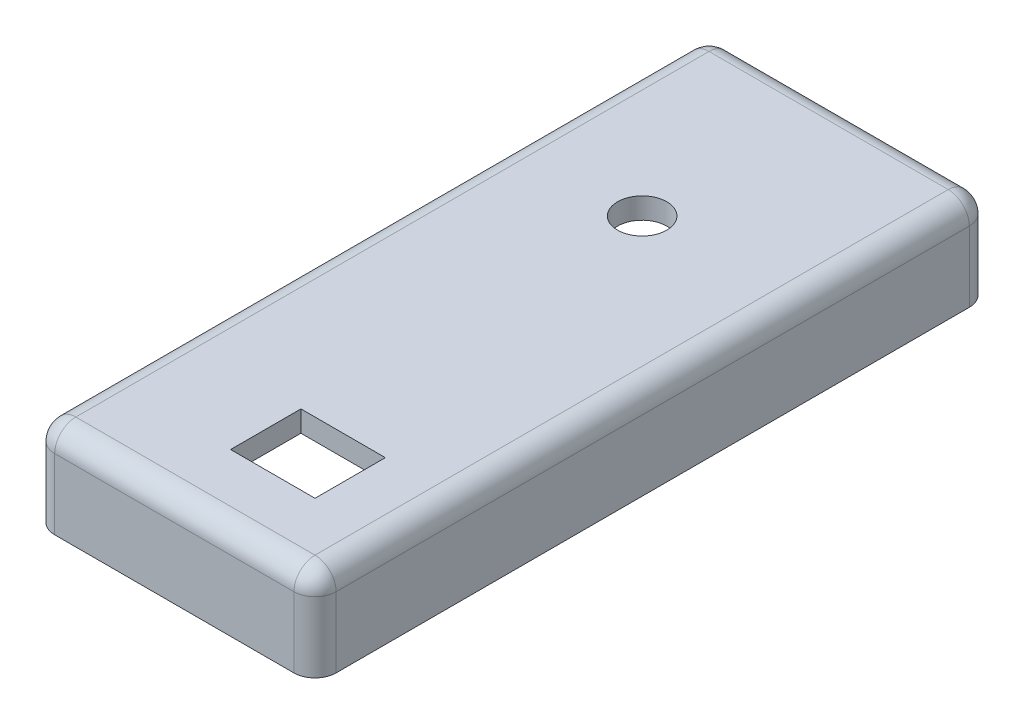
ISO-10303-21;
HEADER;
FILE_DESCRIPTION(('STEP AP214'),'2;1');
FILE_NAME('part.step','',(''),(''),'','','');
FILE_SCHEMA(('AUTOMOTIVE_DESIGN { 1 0 10303 214 1 1 1 1 }'));
ENDSEC;
DATA;
#1=APPLICATION_CONTEXT('core data for automotive mechanical design processes');
#2=APPLICATION_PROTOCOL_DEFINITION('international standard','automotive_design',2000,#1);
#3=PRODUCT_CONTEXT('',#1,'mechanical');
#4=PRODUCT('Part','Part','',(#3));
#5=PRODUCT_RELATED_PRODUCT_CATEGORY('part','',(#4));
#6=PRODUCT_DEFINITION_FORMATION('','',#4);
#7=PRODUCT_DEFINITION_CONTEXT('part definition',#1,'design');
#8=PRODUCT_DEFINITION('design','',#6,#7);
#9=PRODUCT_DEFINITION_SHAPE('','',#8);
#10=(LENGTH_UNIT() NAMED_UNIT(*) SI_UNIT(.MILLI.,.METRE.));
#11=(NAMED_UNIT(*) PLANE_ANGLE_UNIT() SI_UNIT($,.RADIAN.));
#12=(NAMED_UNIT(*) SI_UNIT($,.STERADIAN.) SOLID_ANGLE_UNIT());
#13=UNCERTAINTY_MEASURE_WITH_UNIT(LENGTH_MEASURE(1.E-05),#10,'distance_accuracy_value','');
#14=(GEOMETRIC_REPRESENTATION_CONTEXT(3) GLOBAL_UNCERTAINTY_ASSIGNED_CONTEXT((#13)) GLOBAL_UNIT_ASSIGNED_CONTEXT((#10,
#11,#12)) REPRESENTATION_CONTEXT('',''));
#15=CARTESIAN_POINT('',(0.,0.,0.));
#16=DIRECTION('',(0.,0.,1.));
#17=DIRECTION('',(1.,0.,0.));
#18=AXIS2_PLACEMENT_3D('',#15,#16,#17);
#19=CARTESIAN_POINT('',(0.,0.,0.));
#20=DIRECTION('',(0.,1.,0.));
#21=DIRECTION('',(0.,0.,1.));
#22=AXIS2_PLACEMENT_3D('',#19,#20,#21);
#23=PLANE('',#22);
#24=DIRECTION('',(0.,0.,1.));
#25=VECTOR('',#24,1.);
#26=CARTESIAN_POINT('',(-21.5576292376695,0.,-48.0700530900822));
#27=LINE('',#26,#25);
#28=CARTESIAN_POINT('',(-21.5576292376695,0.,-45.0700530900821));
#29=VERTEX_POINT('',#28);
#30=CARTESIAN_POINT('',(-21.5576292376695,0.,44.9299469099178));
#31=VERTEX_POINT('',#30);
#32=EDGE_CURVE('E237',#29,#31,#27,.T.);
#33=ORIENTED_EDGE('',*,*,#32,.F.);
#34=CARTESIAN_POINT('',(-18.5576292376695,0.,-45.0700530900821));
#35=DIRECTION('',(0.,1.,0.));
#36=DIRECTION('',(0.,0.,1.));
#37=AXIS2_PLACEMENT_3D('',#34,#35,#36);
#38=CIRCLE('',#37,3.);
#39=CARTESIAN_POINT('',(-18.5576292376695,0.,-48.0700530900822));
#40=VERTEX_POINT('',#39);
#41=EDGE_CURVE('E262',#29,#40,#38,.F.);
#42=ORIENTED_EDGE('',*,*,#41,.T.);
#43=DIRECTION('',(-1.,0.,0.));
#44=VECTOR('',#43,1.);
#45=CARTESIAN_POINT('',(-21.5576292376695,0.,-48.0700530900822));
#46=LINE('',#45,#44);
#47=CARTESIAN_POINT('',(15.4423707623305,0.,-48.0700530900822));
#48=VERTEX_POINT('',#47);
#49=EDGE_CURVE('E246',#48,#40,#46,.T.);
#50=ORIENTED_EDGE('',*,*,#49,.F.);
#51=CARTESIAN_POINT('',(15.4423707623305,0.,-45.0700530900821));
#52=DIRECTION('',(0.,1.,0.));
#53=DIRECTION('',(0.,0.,1.));
#54=AXIS2_PLACEMENT_3D('',#51,#52,#53);
#55=CIRCLE('',#54,3.);
#56=CARTESIAN_POINT('',(18.4423707623305,0.,-45.0700530900821));
#57=VERTEX_POINT('',#56);
#58=EDGE_CURVE('E260',#48,#57,#55,.F.);
#59=ORIENTED_EDGE('',*,*,#58,.T.);
#60=DIRECTION('',(0.,0.,-1.));
#61=VECTOR('',#60,1.);
#62=CARTESIAN_POINT('',(18.4423707623305,0.,-48.0700530900822));
#63=LINE('',#62,#61);
#64=CARTESIAN_POINT('',(18.4423707623305,0.,44.9299469099178));
#65=VERTEX_POINT('',#64);
#66=EDGE_CURVE('E243',#65,#57,#63,.T.);
#67=ORIENTED_EDGE('',*,*,#66,.F.);
#68=CARTESIAN_POINT('',(15.4423707623305,0.,44.9299469099179));
#69=DIRECTION('',(0.,1.,0.));
#70=DIRECTION('',(0.,0.,1.));
#71=AXIS2_PLACEMENT_3D('',#68,#69,#70);
#72=CIRCLE('',#71,3.);
#73=CARTESIAN_POINT('',(15.4423707623305,0.,47.9299469099179));
#74=VERTEX_POINT('',#73);
#75=EDGE_CURVE('E258',#65,#74,#72,.F.);
#76=ORIENTED_EDGE('',*,*,#75,.T.);
#77=DIRECTION('',(1.,0.,0.));
#78=VECTOR('',#77,1.);
#79=CARTESIAN_POINT('',(-21.5576292376695,0.,47.9299469099179));
#80=LINE('',#79,#78);
#81=CARTESIAN_POINT('',(-18.5576292376695,0.,47.9299469099179));
#82=VERTEX_POINT('',#81);
#83=EDGE_CURVE('E240',#82,#74,#80,.T.);
#84=ORIENTED_EDGE('',*,*,#83,.F.);
#85=CARTESIAN_POINT('',(-18.5576292376695,0.,44.9299469099179));
#86=DIRECTION('',(0.,1.,0.));
#87=DIRECTION('',(0.,0.,1.));
#88=AXIS2_PLACEMENT_3D('',#85,#86,#87);
#89=CIRCLE('',#88,3.);
#90=EDGE_CURVE('E256',#82,#31,#89,.F.);
#91=ORIENTED_EDGE('',*,*,#90,.T.);
#92=EDGE_LOOP('',(#33,#42,#50,#59,#67,#76,#84,#91));
#93=FACE_BOUND('',#92,.T.);
#94=DIRECTION('',(0.,0.,1.));
#95=VECTOR('',#94,1.);
#96=CARTESIAN_POINT('',(-18.5576292376695,0.,-45.0700530900821));
#97=LINE('',#96,#95);
#98=CARTESIAN_POINT('',(-18.5576292376695,0.,-45.0700530900821));
#99=VERTEX_POINT('',#98);
#100=CARTESIAN_POINT('',(-18.5576292376695,0.,45.4299469099179));
#101=VERTEX_POINT('',#100);
#102=EDGE_CURVE('E217',#99,#101,#97,.T.);
#103=ORIENTED_EDGE('',*,*,#102,.T.);
#104=DIRECTION('',(1.,0.,0.));
#105=VECTOR('',#104,1.);
#106=CARTESIAN_POINT('',(-18.5576292376695,0.,45.4299469099179));
#107=LINE('',#106,#105);
#108=CARTESIAN_POINT('',(15.9423707623305,0.,45.4299469099179));
#109=VERTEX_POINT('',#108);
#110=EDGE_CURVE('E220',#101,#109,#107,.T.);
#111=ORIENTED_EDGE('',*,*,#110,.T.);
#112=DIRECTION('',(0.,0.,-1.));
#113=VECTOR('',#112,1.);
#114=CARTESIAN_POINT('',(15.9423707623305,0.,-45.0700530900821));
#115=LINE('',#114,#113);
#116=CARTESIAN_POINT('',(15.9423707623305,0.,-45.0700530900821));
#117=VERTEX_POINT('',#116);
#118=EDGE_CURVE('E223',#109,#117,#115,.T.);
#119=ORIENTED_EDGE('',*,*,#118,.T.);
#120=DIRECTION('',(-1.,0.,0.));
#121=VECTOR('',#120,1.);
#122=CARTESIAN_POINT('',(-18.5576292376695,0.,-45.0700530900821));
#123=LINE('',#122,#121);
#124=EDGE_CURVE('E207',#117,#99,#123,.T.);
#125=ORIENTED_EDGE('',*,*,#124,.T.);
#126=EDGE_LOOP('',(#103,#111,#119,#125));
#127=FACE_BOUND('',#126,.T.);
#128=ADVANCED_FACE('F33',(#93,#127),#23,.F.);
#129=CARTESIAN_POINT('',(-21.5576292376695,10.,-48.0700530900822));
#130=DIRECTION('',(1.,0.,0.));
#131=DIRECTION('',(0.,0.,-1.));
#132=AXIS2_PLACEMENT_3D('',#129,#130,#131);
#133=PLANE('',#132);
#134=DIRECTION('',(0.,0.,1.));
#135=VECTOR('',#134,1.);
#136=CARTESIAN_POINT('',(-21.5576292376695,10.,-48.0700530900822));
#137=LINE('',#136,#135);
#138=CARTESIAN_POINT('',(-21.5576292376695,10.,44.9299469099179));
#139=VERTEX_POINT('',#138);
#140=CARTESIAN_POINT('',(-21.5576292376695,10.,-45.0700530900821));
#141=VERTEX_POINT('',#140);
#142=EDGE_CURVE('E249',#139,#141,#137,.F.);
#143=ORIENTED_EDGE('',*,*,#142,.T.);
#144=DIRECTION('',(0.,-1.,0.));
#145=VECTOR('',#144,1.);
#146=CARTESIAN_POINT('',(-21.5576292376695,10.,-45.0700530900821));
#147=LINE('',#146,#145);
#148=EDGE_CURVE('E253',#141,#29,#147,.T.);
#149=ORIENTED_EDGE('',*,*,#148,.T.);
#150=ORIENTED_EDGE('',*,*,#32,.T.);
#151=DIRECTION('',(0.,-1.,0.));
#152=VECTOR('',#151,1.);
#153=CARTESIAN_POINT('',(-21.5576292376695,10.,44.9299469099179));
#154=LINE('',#153,#152);
#155=EDGE_CURVE('E251',#31,#139,#154,.F.);
#156=ORIENTED_EDGE('',*,*,#155,.T.);
#157=EDGE_LOOP('',(#143,#149,#150,#156));
#158=FACE_BOUND('',#157,.T.);
#159=ADVANCED_FACE('F377',(#158),#133,.F.);
#160=CARTESIAN_POINT('',(-21.5576292376695,10.,47.9299469099179));
#161=DIRECTION('',(0.,0.,-1.));
#162=DIRECTION('',(-1.,0.,0.));
#163=AXIS2_PLACEMENT_3D('',#160,#161,#162);
#164=PLANE('',#163);
#165=ORIENTED_EDGE('',*,*,#83,.T.);
#166=DIRECTION('',(0.,-1.,0.));
#167=VECTOR('',#166,1.);
#168=CARTESIAN_POINT('',(15.4423707623305,10.,47.9299469099179));
#169=LINE('',#168,#167);
#170=CARTESIAN_POINT('',(15.4423707623305,10.,47.9299469099179));
#171=VERTEX_POINT('',#170);
#172=EDGE_CURVE('E280',#74,#171,#169,.F.);
#173=ORIENTED_EDGE('',*,*,#172,.T.);
#174=DIRECTION('',(1.,0.,0.));
#175=VECTOR('',#174,1.);
#176=CARTESIAN_POINT('',(-21.5576292376695,10.,47.9299469099179));
#177=LINE('',#176,#175);
#178=CARTESIAN_POINT('',(-18.5576292376695,10.,47.9299469099179));
#179=VERTEX_POINT('',#178);
#180=EDGE_CURVE('E276',#171,#179,#177,.F.);
#181=ORIENTED_EDGE('',*,*,#180,.T.);
#182=DIRECTION('',(0.,-1.,0.));
#183=VECTOR('',#182,1.);
#184=CARTESIAN_POINT('',(-18.5576292376695,10.,47.9299469099179));
#185=LINE('',#184,#183);
#186=EDGE_CURVE('E278',#179,#82,#185,.T.);
#187=ORIENTED_EDGE('',*,*,#186,.T.);
#188=EDGE_LOOP('',(#165,#173,#181,#187));
#189=FACE_BOUND('',#188,.T.);
#190=ADVANCED_FACE('F371',(#189),#164,.F.);
#191=CARTESIAN_POINT('',(18.4423707623305,10.,-48.0700530900822));
#192=DIRECTION('',(-1.,0.,0.));
#193=DIRECTION('',(0.,0.,1.));
#194=AXIS2_PLACEMENT_3D('',#191,#192,#193);
#195=PLANE('',#194);
#196=ORIENTED_EDGE('',*,*,#66,.T.);
#197=DIRECTION('',(0.,-1.,0.));
#198=VECTOR('',#197,1.);
#199=CARTESIAN_POINT('',(18.4423707623305,10.,-45.0700530900821));
#200=LINE('',#199,#198);
#201=CARTESIAN_POINT('',(18.4423707623305,10.,-45.0700530900821));
#202=VERTEX_POINT('',#201);
#203=EDGE_CURVE('E274',#57,#202,#200,.F.);
#204=ORIENTED_EDGE('',*,*,#203,.T.);
#205=DIRECTION('',(0.,0.,-1.));
#206=VECTOR('',#205,1.);
#207=CARTESIAN_POINT('',(18.4423707623305,10.,-48.0700530900822));
#208=LINE('',#207,#206);
#209=CARTESIAN_POINT('',(18.4423707623305,10.,44.9299469099179));
#210=VERTEX_POINT('',#209);
#211=EDGE_CURVE('E270',#202,#210,#208,.F.);
#212=ORIENTED_EDGE('',*,*,#211,.T.);
#213=DIRECTION('',(0.,-1.,0.));
#214=VECTOR('',#213,1.);
#215=CARTESIAN_POINT('',(18.4423707623305,10.,44.9299469099179));
#216=LINE('',#215,#214);
#217=EDGE_CURVE('E272',#210,#65,#216,.T.);
#218=ORIENTED_EDGE('',*,*,#217,.T.);
#219=EDGE_LOOP('',(#196,#204,#212,#218));
#220=FACE_BOUND('',#219,.T.);
#221=ADVANCED_FACE('F332',(#220),#195,.F.);
#222=CARTESIAN_POINT('',(-21.5576292376695,10.,-48.0700530900822));
#223=DIRECTION('',(0.,0.,1.));
#224=DIRECTION('',(1.,0.,0.));
#225=AXIS2_PLACEMENT_3D('',#222,#223,#224);
#226=PLANE('',#225);
#227=ORIENTED_EDGE('',*,*,#49,.T.);
#228=DIRECTION('',(0.,-1.,0.));
#229=VECTOR('',#228,1.);
#230=CARTESIAN_POINT('',(-18.5576292376695,10.,-48.0700530900822));
#231=LINE('',#230,#229);
#232=CARTESIAN_POINT('',(-18.5576292376695,10.,-48.0700530900822));
#233=VERTEX_POINT('',#232);
#234=EDGE_CURVE('E268',#40,#233,#231,.F.);
#235=ORIENTED_EDGE('',*,*,#234,.T.);
#236=DIRECTION('',(-1.,0.,0.));
#237=VECTOR('',#236,1.);
#238=CARTESIAN_POINT('',(-21.5576292376695,10.,-48.0700530900822));
#239=LINE('',#238,#237);
#240=CARTESIAN_POINT('',(15.4423707623305,10.,-48.0700530900822));
#241=VERTEX_POINT('',#240);
#242=EDGE_CURVE('E264',#233,#241,#239,.F.);
#243=ORIENTED_EDGE('',*,*,#242,.T.);
#244=DIRECTION('',(0.,-1.,0.));
#245=VECTOR('',#244,1.);
#246=CARTESIAN_POINT('',(15.4423707623305,10.,-48.0700530900822));
#247=LINE('',#246,#245);
#248=EDGE_CURVE('E266',#241,#48,#247,.T.);
#249=ORIENTED_EDGE('',*,*,#248,.T.);
#250=EDGE_LOOP('',(#227,#235,#243,#249));
#251=FACE_BOUND('',#250,.T.);
#252=ADVANCED_FACE('F383',(#251),#226,.F.);
#253=CARTESIAN_POINT('',(-18.5576292376695,10.,-45.0700530900821));
#254=DIRECTION('',(1.,0.,0.));
#255=DIRECTION('',(0.,0.,-1.));
#256=AXIS2_PLACEMENT_3D('',#253,#254,#255);
#257=PLANE('',#256);
#258=ORIENTED_EDGE('',*,*,#102,.F.);
#259=DIRECTION('',(0.,-1.,0.));
#260=VECTOR('',#259,1.);
#261=CARTESIAN_POINT('',(-18.5576292376695,10.,-45.0700530900821));
#262=LINE('',#261,#260);
#263=CARTESIAN_POINT('',(-18.5576292376695,10.,-45.0700530900821));
#264=VERTEX_POINT('',#263);
#265=EDGE_CURVE('E216',#264,#99,#262,.T.);
#266=ORIENTED_EDGE('',*,*,#265,.F.);
#267=DIRECTION('',(0.,0.,1.));
#268=VECTOR('',#267,1.);
#269=CARTESIAN_POINT('',(-18.5576292376695,10.,-45.0700530900821));
#270=LINE('',#269,#268);
#271=CARTESIAN_POINT('',(-18.5576292376695,10.,45.4299469099179));
#272=VERTEX_POINT('',#271);
#273=EDGE_CURVE('E203',#264,#272,#270,.T.);
#274=ORIENTED_EDGE('',*,*,#273,.T.);
#275=DIRECTION('',(0.,-1.,0.));
#276=VECTOR('',#275,1.);
#277=CARTESIAN_POINT('',(-18.5576292376695,10.,45.4299469099179));
#278=LINE('',#277,#276);
#279=EDGE_CURVE('E234',#272,#101,#278,.T.);
#280=ORIENTED_EDGE('',*,*,#279,.T.);
#281=EDGE_LOOP('',(#258,#266,#274,#280));
#282=FACE_BOUND('',#281,.T.);
#283=ADVANCED_FACE('F403',(#282),#257,.T.);
#284=CARTESIAN_POINT('',(-18.5576292376695,10.,45.4299469099179));
#285=DIRECTION('',(0.,0.,-1.));
#286=DIRECTION('',(-1.,0.,0.));
#287=AXIS2_PLACEMENT_3D('',#284,#285,#286);
#288=PLANE('',#287);
#289=ORIENTED_EDGE('',*,*,#110,.F.);
#290=ORIENTED_EDGE('',*,*,#279,.F.);
#291=DIRECTION('',(1.,0.,0.));
#292=VECTOR('',#291,1.);
#293=CARTESIAN_POINT('',(-18.5576292376695,10.,45.4299469099179));
#294=LINE('',#293,#292);
#295=CARTESIAN_POINT('',(15.9423707623305,10.,45.4299469099179));
#296=VERTEX_POINT('',#295);
#297=EDGE_CURVE('E206',#272,#296,#294,.T.);
#298=ORIENTED_EDGE('',*,*,#297,.T.);
#299=DIRECTION('',(0.,-1.,0.));
#300=VECTOR('',#299,1.);
#301=CARTESIAN_POINT('',(15.9423707623305,10.,45.4299469099179));
#302=LINE('',#301,#300);
#303=EDGE_CURVE('E232',#296,#109,#302,.T.);
#304=ORIENTED_EDGE('',*,*,#303,.T.);
#305=EDGE_LOOP('',(#289,#290,#298,#304));
#306=FACE_BOUND('',#305,.T.);
#307=ADVANCED_FACE('F429',(#306),#288,.T.);
#308=CARTESIAN_POINT('',(15.9423707623305,10.,-45.0700530900821));
#309=DIRECTION('',(-1.,0.,0.));
#310=DIRECTION('',(0.,0.,1.));
#311=AXIS2_PLACEMENT_3D('',#308,#309,#310);
#312=PLANE('',#311);
#313=ORIENTED_EDGE('',*,*,#118,.F.);
#314=ORIENTED_EDGE('',*,*,#303,.F.);
#315=DIRECTION('',(0.,0.,-1.));
#316=VECTOR('',#315,1.);
#317=CARTESIAN_POINT('',(15.9423707623305,10.,-45.0700530900821));
#318=LINE('',#317,#316);
#319=CARTESIAN_POINT('',(15.9423707623305,10.,-45.0700530900821));
#320=VERTEX_POINT('',#319);
#321=EDGE_CURVE('E210',#296,#320,#318,.T.);
#322=ORIENTED_EDGE('',*,*,#321,.T.);
#323=DIRECTION('',(0.,-1.,0.));
#324=VECTOR('',#323,1.);
#325=CARTESIAN_POINT('',(15.9423707623305,10.,-45.0700530900821));
#326=LINE('',#325,#324);
#327=EDGE_CURVE('E230',#320,#117,#326,.T.);
#328=ORIENTED_EDGE('',*,*,#327,.T.);
#329=EDGE_LOOP('',(#313,#314,#322,#328));
#330=FACE_BOUND('',#329,.T.);
#331=ADVANCED_FACE('F436',(#330),#312,.T.);
#332=CARTESIAN_POINT('',(-18.5576292376695,10.,-45.0700530900821));
#333=DIRECTION('',(0.,0.,1.));
#334=DIRECTION('',(1.,0.,0.));
#335=AXIS2_PLACEMENT_3D('',#332,#333,#334);
#336=PLANE('',#335);
#337=ORIENTED_EDGE('',*,*,#124,.F.);
#338=ORIENTED_EDGE('',*,*,#327,.F.);
#339=DIRECTION('',(-1.,0.,0.));
#340=VECTOR('',#339,1.);
#341=CARTESIAN_POINT('',(-18.5576292376695,10.,-45.0700530900821));
#342=LINE('',#341,#340);
#343=EDGE_CURVE('E213',#320,#264,#342,.T.);
#344=ORIENTED_EDGE('',*,*,#343,.T.);
#345=ORIENTED_EDGE('',*,*,#265,.T.);
#346=EDGE_LOOP('',(#337,#338,#344,#345));
#347=FACE_BOUND('',#346,.T.);
#348=ADVANCED_FACE('F443',(#347),#336,.T.);
#349=CARTESIAN_POINT('',(0.,10.,0.));
#350=DIRECTION('',(0.,-1.,0.));
#351=DIRECTION('',(0.,0.,-1.));
#352=AXIS2_PLACEMENT_3D('',#349,#350,#351);
#353=PLANE('',#352);
#354=DIRECTION('',(0.,0.,-1.));
#355=VECTOR('',#354,1.);
#356=CARTESIAN_POINT('',(-3.55762923766952,10.,37.9299469099179));
#357=LINE('',#356,#355);
#358=CARTESIAN_POINT('',(-3.55762923766952,10.,37.9299469099179));
#359=VERTEX_POINT('',#358);
#360=CARTESIAN_POINT('',(-3.55762923766952,10.,27.9299469099179));
#361=VERTEX_POINT('',#360);
#362=EDGE_CURVE('E50',#359,#361,#357,.T.);
#363=ORIENTED_EDGE('',*,*,#362,.F.);
#364=DIRECTION('',(-1.,0.,0.));
#365=VECTOR('',#364,1.);
#366=CARTESIAN_POINT('',(8.44237076233049,10.,37.9299469099179));
#367=LINE('',#366,#365);
#368=CARTESIAN_POINT('',(8.44237076233049,10.,37.9299469099179));
#369=VERTEX_POINT('',#368);
#370=EDGE_CURVE('E178',#369,#359,#367,.T.);
#371=ORIENTED_EDGE('',*,*,#370,.F.);
#372=DIRECTION('',(0.,0.,1.));
#373=VECTOR('',#372,1.);
#374=CARTESIAN_POINT('',(8.44237076233049,10.,37.9299469099179));
#375=LINE('',#374,#373);
#376=CARTESIAN_POINT('',(8.44237076233049,10.,27.9299469099179));
#377=VERTEX_POINT('',#376);
#378=EDGE_CURVE('E181',#377,#369,#375,.T.);
#379=ORIENTED_EDGE('',*,*,#378,.F.);
#380=DIRECTION('',(1.,0.,0.));
#381=VECTOR('',#380,1.);
#382=CARTESIAN_POINT('',(8.44237076233049,10.,27.9299469099179));
#383=LINE('',#382,#381);
#384=EDGE_CURVE('E187',#361,#377,#383,.T.);
#385=ORIENTED_EDGE('',*,*,#384,.F.);
#386=EDGE_LOOP('',(#363,#371,#379,#385));
#387=FACE_BOUND('',#386,.T.);
#388=CARTESIAN_POINT('',(-3.05762923766952,10.,-20.0700530900821));
#389=DIRECTION('',(0.,-1.,0.));
#390=DIRECTION('',(0.,0.,-1.));
#391=AXIS2_PLACEMENT_3D('',#388,#389,#390);
#392=CIRCLE('',#391,3.5);
#393=CARTESIAN_POINT('',(-3.05762923766952,10.,-23.5700530900821));
#394=VERTEX_POINT('',#393);
#395=EDGE_CURVE('E193',#394,#394,#392,.T.);
#396=ORIENTED_EDGE('',*,*,#395,.F.);
#397=EDGE_LOOP('',(#396));
#398=FACE_BOUND('',#397,.T.);
#399=ORIENTED_EDGE('',*,*,#297,.F.);
#400=ORIENTED_EDGE('',*,*,#273,.F.);
#401=ORIENTED_EDGE('',*,*,#343,.F.);
#402=ORIENTED_EDGE('',*,*,#321,.F.);
#403=EDGE_LOOP('',(#399,#400,#401,#402));
#404=FACE_BOUND('',#403,.T.);
#405=ADVANCED_FACE('F451',(#387,#398,#404),#353,.T.);
#406=CARTESIAN_POINT('',(0.,13.,0.));
#407=DIRECTION('',(0.,-1.,0.));
#408=DIRECTION('',(0.,0.,-1.));
#409=AXIS2_PLACEMENT_3D('',#406,#407,#408);
#410=PLANE('',#409);
#411=DIRECTION('',(-1.,0.,0.));
#412=VECTOR('',#411,1.);
#413=CARTESIAN_POINT('',(8.44237076233049,13.,37.9299469099179));
#414=LINE('',#413,#412);
#415=CARTESIAN_POINT('',(8.44237076233049,13.,37.9299469099179));
#416=VERTEX_POINT('',#415);
#417=CARTESIAN_POINT('',(-3.55762923766952,13.,37.9299469099179));
#418=VERTEX_POINT('',#417);
#419=EDGE_CURVE('E168',#416,#418,#414,.T.);
#420=ORIENTED_EDGE('',*,*,#419,.T.);
#421=DIRECTION('',(0.,0.,-1.));
#422=VECTOR('',#421,1.);
#423=CARTESIAN_POINT('',(-3.55762923766952,13.,37.9299469099179));
#424=LINE('',#423,#422);
#425=CARTESIAN_POINT('',(-3.55762923766952,13.,27.9299469099179));
#426=VERTEX_POINT('',#425);
#427=EDGE_CURVE('E162',#418,#426,#424,.T.);
#428=ORIENTED_EDGE('',*,*,#427,.T.);
#429=DIRECTION('',(1.,0.,0.));
#430=VECTOR('',#429,1.);
#431=CARTESIAN_POINT('',(8.44237076233049,13.,27.9299469099179));
#432=LINE('',#431,#430);
#433=CARTESIAN_POINT('',(8.44237076233049,13.,27.9299469099179));
#434=VERTEX_POINT('',#433);
#435=EDGE_CURVE('E171',#426,#434,#432,.T.);
#436=ORIENTED_EDGE('',*,*,#435,.T.);
#437=DIRECTION('',(0.,0.,1.));
#438=VECTOR('',#437,1.);
#439=CARTESIAN_POINT('',(8.44237076233049,13.,37.9299469099179));
#440=LINE('',#439,#438);
#441=EDGE_CURVE('E58',#434,#416,#440,.T.);
#442=ORIENTED_EDGE('',*,*,#441,.T.);
#443=EDGE_LOOP('',(#420,#428,#436,#442));
#444=FACE_BOUND('',#443,.T.);
#445=CARTESIAN_POINT('',(-3.05762923766952,13.,-20.0700530900821));
#446=DIRECTION('',(0.,-1.,0.));
#447=DIRECTION('',(0.,0.,-1.));
#448=AXIS2_PLACEMENT_3D('',#445,#446,#447);
#449=CIRCLE('',#448,3.5);
#450=CARTESIAN_POINT('',(-3.05762923766952,13.,-23.5700530900821));
#451=VERTEX_POINT('',#450);
#452=EDGE_CURVE('E197',#451,#451,#449,.T.);
#453=ORIENTED_EDGE('',*,*,#452,.T.);
#454=EDGE_LOOP('',(#453));
#455=FACE_BOUND('',#454,.T.);
#456=DIRECTION('',(0.,0.,1.));
#457=VECTOR('',#456,1.);
#458=CARTESIAN_POINT('',(-18.5576292376695,13.,0.));
#459=LINE('',#458,#457);
#460=CARTESIAN_POINT('',(-18.5576292376695,13.,-45.0700530900821));
#461=VERTEX_POINT('',#460);
#462=CARTESIAN_POINT('',(-18.5576292376695,13.,44.9299469099179));
#463=VERTEX_POINT('',#462);
#464=EDGE_CURVE('E282',#461,#463,#459,.T.);
#465=ORIENTED_EDGE('',*,*,#464,.T.);
#466=DIRECTION('',(1.,0.,0.));
#467=VECTOR('',#466,1.);
#468=CARTESIAN_POINT('',(0.,13.,44.9299469099179));
#469=LINE('',#468,#467);
#470=CARTESIAN_POINT('',(15.4423707623305,13.,44.9299469099179));
#471=VERTEX_POINT('',#470);
#472=EDGE_CURVE('E11',#463,#471,#469,.T.);
#473=ORIENTED_EDGE('',*,*,#472,.T.);
#474=DIRECTION('',(0.,0.,-1.));
#475=VECTOR('',#474,1.);
#476=CARTESIAN_POINT('',(15.4423707623305,13.,0.));
#477=LINE('',#476,#475);
#478=CARTESIAN_POINT('',(15.4423707623305,13.,-45.0700530900821));
#479=VERTEX_POINT('',#478);
#480=EDGE_CURVE('E42',#471,#479,#477,.T.);
#481=ORIENTED_EDGE('',*,*,#480,.T.);
#482=DIRECTION('',(-1.,0.,0.));
#483=VECTOR('',#482,1.);
#484=CARTESIAN_POINT('',(0.,13.,-45.0700530900821));
#485=LINE('',#484,#483);
#486=EDGE_CURVE('E284',#479,#461,#485,.T.);
#487=ORIENTED_EDGE('',*,*,#486,.T.);
#488=EDGE_LOOP('',(#465,#473,#481,#487));
#489=FACE_BOUND('',#488,.T.);
#490=ADVANCED_FACE('F175',(#444,#455,#489),#410,.F.);
#491=CARTESIAN_POINT('',(15.4423707623305,10.,44.9299469099179));
#492=DIRECTION('',(0.,-1.,0.));
#493=DIRECTION('',(0.,0.,-1.));
#494=AXIS2_PLACEMENT_3D('',#491,#492,#493);
#495=CYLINDRICAL_SURFACE('',#494,3.);
#496=CARTESIAN_POINT('',(15.4423707623305,10.,44.9299469099179));
#497=DIRECTION('',(0.,1.,0.));
#498=DIRECTION('',(0.,0.,1.));
#499=AXIS2_PLACEMENT_3D('',#496,#497,#498);
#500=CIRCLE('',#499,3.);
#501=EDGE_CURVE('E37',#171,#210,#500,.T.);
#502=ORIENTED_EDGE('',*,*,#501,.F.);
#503=ORIENTED_EDGE('',*,*,#172,.F.);
#504=ORIENTED_EDGE('',*,*,#75,.F.);
#505=ORIENTED_EDGE('',*,*,#217,.F.);
#506=EDGE_LOOP('',(#502,#503,#504,#505));
#507=FACE_BOUND('',#506,.T.);
#508=ADVANCED_FACE('F35',(#507),#495,.T.);
#509=CARTESIAN_POINT('',(15.4423707623305,10.,44.9299469099179));
#510=DIRECTION('',(0.,0.,1.));
#511=DIRECTION('',(1.,0.,0.));
#512=AXIS2_PLACEMENT_3D('',#509,#510,#511);
#513=SPHERICAL_SURFACE('',#512,3.);
#514=CARTESIAN_POINT('',(15.4423707623305,10.,44.9299469099179));
#515=DIRECTION('',(1.,0.,0.));
#516=DIRECTION('',(0.,0.,-1.));
#517=AXIS2_PLACEMENT_3D('',#514,#515,#516);
#518=CIRCLE('',#517,3.);
#519=EDGE_CURVE('E313',#171,#471,#518,.F.);
#520=ORIENTED_EDGE('',*,*,#519,.F.);
#521=ORIENTED_EDGE('',*,*,#501,.T.);
#522=CARTESIAN_POINT('',(15.4423707623305,10.,44.9299469099179));
#523=DIRECTION('',(0.,0.,1.));
#524=DIRECTION('',(1.,0.,0.));
#525=AXIS2_PLACEMENT_3D('',#522,#523,#524);
#526=CIRCLE('',#525,3.);
#527=EDGE_CURVE('E315',#471,#210,#526,.F.);
#528=ORIENTED_EDGE('',*,*,#527,.F.);
#529=EDGE_LOOP('',(#520,#521,#528));
#530=FACE_BOUND('',#529,.T.);
#531=ADVANCED_FACE('F324',(#530),#513,.T.);
#532=CARTESIAN_POINT('',(15.4423707623305,10.,-45.0700530900821));
#533=DIRECTION('',(0.,-1.,0.));
#534=DIRECTION('',(0.,0.,-1.));
#535=AXIS2_PLACEMENT_3D('',#532,#533,#534);
#536=CYLINDRICAL_SURFACE('',#535,3.);
#537=ORIENTED_EDGE('',*,*,#58,.F.);
#538=ORIENTED_EDGE('',*,*,#248,.F.);
#539=CARTESIAN_POINT('',(15.4423707623305,10.,-45.0700530900821));
#540=DIRECTION('',(0.,1.,0.));
#541=DIRECTION('',(0.,0.,1.));
#542=AXIS2_PLACEMENT_3D('',#539,#540,#541);
#543=CIRCLE('',#542,3.);
#544=EDGE_CURVE('E310',#202,#241,#543,.T.);
#545=ORIENTED_EDGE('',*,*,#544,.F.);
#546=ORIENTED_EDGE('',*,*,#203,.F.);
#547=EDGE_LOOP('',(#537,#538,#545,#546));
#548=FACE_BOUND('',#547,.T.);
#549=ADVANCED_FACE('F342',(#548),#536,.T.);
#550=CARTESIAN_POINT('',(15.4423707623305,10.,0.));
#551=DIRECTION('',(0.,0.,-1.));
#552=DIRECTION('',(-1.,0.,0.));
#553=AXIS2_PLACEMENT_3D('',#550,#551,#552);
#554=CYLINDRICAL_SURFACE('',#553,3.);
#555=ORIENTED_EDGE('',*,*,#527,.T.);
#556=ORIENTED_EDGE('',*,*,#211,.F.);
#557=CARTESIAN_POINT('',(15.4423707623305,10.,-45.0700530900821));
#558=DIRECTION('',(0.,0.,-1.));
#559=DIRECTION('',(-1.,0.,0.));
#560=AXIS2_PLACEMENT_3D('',#557,#558,#559);
#561=CIRCLE('',#560,3.);
#562=EDGE_CURVE('E307',#479,#202,#561,.T.);
#563=ORIENTED_EDGE('',*,*,#562,.F.);
#564=ORIENTED_EDGE('',*,*,#480,.F.);
#565=EDGE_LOOP('',(#555,#556,#563,#564));
#566=FACE_BOUND('',#565,.T.);
#567=ADVANCED_FACE('F345',(#566),#554,.T.);
#568=CARTESIAN_POINT('',(0.,10.,44.9299469099179));
#569=DIRECTION('',(1.,0.,0.));
#570=DIRECTION('',(0.,0.,-1.));
#571=AXIS2_PLACEMENT_3D('',#568,#569,#570);
#572=CYLINDRICAL_SURFACE('',#571,3.);
#573=ORIENTED_EDGE('',*,*,#519,.T.);
#574=ORIENTED_EDGE('',*,*,#472,.F.);
#575=CARTESIAN_POINT('',(-18.5576292376695,10.,44.9299469099179));
#576=DIRECTION('',(-1.,0.,0.));
#577=DIRECTION('',(0.,0.,1.));
#578=AXIS2_PLACEMENT_3D('',#575,#576,#577);
#579=CIRCLE('',#578,3.);
#580=EDGE_CURVE('E304',#179,#463,#579,.T.);
#581=ORIENTED_EDGE('',*,*,#580,.F.);
#582=ORIENTED_EDGE('',*,*,#180,.F.);
#583=EDGE_LOOP('',(#573,#574,#581,#582));
#584=FACE_BOUND('',#583,.T.);
#585=ADVANCED_FACE('F368',(#584),#572,.T.);
#586=CARTESIAN_POINT('',(-18.5576292376695,10.,44.9299469099179));
#587=DIRECTION('',(0.,-1.,0.));
#588=DIRECTION('',(0.,0.,-1.));
#589=AXIS2_PLACEMENT_3D('',#586,#587,#588);
#590=CYLINDRICAL_SURFACE('',#589,3.);
#591=ORIENTED_EDGE('',*,*,#90,.F.);
#592=ORIENTED_EDGE('',*,*,#186,.F.);
#593=CARTESIAN_POINT('',(-18.5576292376695,10.,44.9299469099179));
#594=DIRECTION('',(0.,1.,0.));
#595=DIRECTION('',(0.,0.,1.));
#596=AXIS2_PLACEMENT_3D('',#593,#594,#595);
#597=CIRCLE('',#596,3.);
#598=EDGE_CURVE('E301',#139,#179,#597,.T.);
#599=ORIENTED_EDGE('',*,*,#598,.F.);
#600=ORIENTED_EDGE('',*,*,#155,.F.);
#601=EDGE_LOOP('',(#591,#592,#599,#600));
#602=FACE_BOUND('',#601,.T.);
#603=ADVANCED_FACE('F374',(#602),#590,.T.);
#604=CARTESIAN_POINT('',(15.4423707623305,10.,-45.0700530900821));
#605=DIRECTION('',(0.,0.,1.));
#606=DIRECTION('',(1.,0.,0.));
#607=AXIS2_PLACEMENT_3D('',#604,#605,#606);
#608=SPHERICAL_SURFACE('',#607,3.);
#609=ORIENTED_EDGE('',*,*,#562,.T.);
#610=ORIENTED_EDGE('',*,*,#544,.T.);
#611=CARTESIAN_POINT('',(15.4423707623305,10.,-45.0700530900821));
#612=DIRECTION('',(1.,0.,0.));
#613=DIRECTION('',(0.,1.,0.));
#614=AXIS2_PLACEMENT_3D('',#611,#612,#613);
#615=CIRCLE('',#614,3.);
#616=EDGE_CURVE('E298',#479,#241,#615,.F.);
#617=ORIENTED_EDGE('',*,*,#616,.F.);
#618=EDGE_LOOP('',(#609,#610,#617));
#619=FACE_BOUND('',#618,.T.);
#620=ADVANCED_FACE('F349',(#619),#608,.T.);
#621=CARTESIAN_POINT('',(-18.5576292376695,10.,44.9299469099179));
#622=DIRECTION('',(0.,0.,1.));
#623=DIRECTION('',(1.,0.,0.));
#624=AXIS2_PLACEMENT_3D('',#621,#622,#623);
#625=SPHERICAL_SURFACE('',#624,3.);
#626=ORIENTED_EDGE('',*,*,#598,.T.);
#627=ORIENTED_EDGE('',*,*,#580,.T.);
#628=CARTESIAN_POINT('',(-18.5576292376695,10.,44.9299469099179));
#629=DIRECTION('',(0.,0.,1.));
#630=DIRECTION('',(1.,0.,0.));
#631=AXIS2_PLACEMENT_3D('',#628,#629,#630);
#632=CIRCLE('',#631,3.);
#633=EDGE_CURVE('E295',#139,#463,#632,.F.);
#634=ORIENTED_EDGE('',*,*,#633,.F.);
#635=EDGE_LOOP('',(#626,#627,#634));
#636=FACE_BOUND('',#635,.T.);
#637=ADVANCED_FACE('F364',(#636),#625,.T.);
#638=CARTESIAN_POINT('',(0.,10.,-45.0700530900821));
#639=DIRECTION('',(-1.,0.,0.));
#640=DIRECTION('',(0.,0.,1.));
#641=AXIS2_PLACEMENT_3D('',#638,#639,#640);
#642=CYLINDRICAL_SURFACE('',#641,3.);
#643=ORIENTED_EDGE('',*,*,#616,.T.);
#644=ORIENTED_EDGE('',*,*,#242,.F.);
#645=CARTESIAN_POINT('',(-18.5576292376695,10.,-45.0700530900821));
#646=DIRECTION('',(-1.,0.,0.));
#647=DIRECTION('',(0.,0.,1.));
#648=AXIS2_PLACEMENT_3D('',#645,#646,#647);
#649=CIRCLE('',#648,3.);
#650=EDGE_CURVE('E292',#461,#233,#649,.T.);
#651=ORIENTED_EDGE('',*,*,#650,.F.);
#652=ORIENTED_EDGE('',*,*,#486,.F.);
#653=EDGE_LOOP('',(#643,#644,#651,#652));
#654=FACE_BOUND('',#653,.T.);
#655=ADVANCED_FACE('F353',(#654),#642,.T.);
#656=CARTESIAN_POINT('',(-18.5576292376695,10.,0.));
#657=DIRECTION('',(0.,0.,1.));
#658=DIRECTION('',(1.,0.,0.));
#659=AXIS2_PLACEMENT_3D('',#656,#657,#658);
#660=CYLINDRICAL_SURFACE('',#659,3.);
#661=ORIENTED_EDGE('',*,*,#633,.T.);
#662=ORIENTED_EDGE('',*,*,#464,.F.);
#663=CARTESIAN_POINT('',(-18.5576292376695,10.,-45.0700530900821));
#664=DIRECTION('',(0.,0.,-1.));
#665=DIRECTION('',(-1.,0.,0.));
#666=AXIS2_PLACEMENT_3D('',#663,#664,#665);
#667=CIRCLE('',#666,3.);
#668=EDGE_CURVE('E289',#141,#461,#667,.T.);
#669=ORIENTED_EDGE('',*,*,#668,.F.);
#670=ORIENTED_EDGE('',*,*,#142,.F.);
#671=EDGE_LOOP('',(#661,#662,#669,#670));
#672=FACE_BOUND('',#671,.T.);
#673=ADVANCED_FACE('F359',(#672),#660,.T.);
#674=CARTESIAN_POINT('',(-18.5576292376695,10.,-45.0700530900821));
#675=DIRECTION('',(0.,0.,1.));
#676=DIRECTION('',(1.,0.,0.));
#677=AXIS2_PLACEMENT_3D('',#674,#675,#676);
#678=SPHERICAL_SURFACE('',#677,3.);
#679=ORIENTED_EDGE('',*,*,#668,.T.);
#680=ORIENTED_EDGE('',*,*,#650,.T.);
#681=CARTESIAN_POINT('',(-18.5576292376695,10.,-45.0700530900821));
#682=DIRECTION('',(0.,1.,0.));
#683=DIRECTION('',(0.,0.,1.));
#684=AXIS2_PLACEMENT_3D('',#681,#682,#683);
#685=CIRCLE('',#684,3.);
#686=EDGE_CURVE('E200',#141,#233,#685,.F.);
#687=ORIENTED_EDGE('',*,*,#686,.F.);
#688=EDGE_LOOP('',(#679,#680,#687));
#689=FACE_BOUND('',#688,.T.);
#690=ADVANCED_FACE('F385',(#689),#678,.T.);
#691=CARTESIAN_POINT('',(-18.5576292376695,10.,-45.0700530900821));
#692=DIRECTION('',(0.,-1.,0.));
#693=DIRECTION('',(0.,0.,-1.));
#694=AXIS2_PLACEMENT_3D('',#691,#692,#693);
#695=CYLINDRICAL_SURFACE('',#694,3.);
#696=ORIENTED_EDGE('',*,*,#686,.T.);
#697=ORIENTED_EDGE('',*,*,#234,.F.);
#698=ORIENTED_EDGE('',*,*,#41,.F.);
#699=ORIENTED_EDGE('',*,*,#148,.F.);
#700=EDGE_LOOP('',(#696,#697,#698,#699));
#701=FACE_BOUND('',#700,.T.);
#702=ADVANCED_FACE('F380',(#701),#695,.T.);
#703=CARTESIAN_POINT('',(-3.05762923766952,13.,-20.0700530900821));
#704=DIRECTION('',(0.,-1.,0.));
#705=DIRECTION('',(0.,0.,-1.));
#706=AXIS2_PLACEMENT_3D('',#703,#704,#705);
#707=CYLINDRICAL_SURFACE('',#706,3.5);
#708=ORIENTED_EDGE('',*,*,#452,.F.);
#709=EDGE_LOOP('',(#708));
#710=FACE_BOUND('',#709,.T.);
#711=ORIENTED_EDGE('',*,*,#395,.T.);
#712=EDGE_LOOP('',(#711));
#713=FACE_BOUND('',#712,.T.);
#714=ADVANCED_FACE('F392',(#710,#713),#707,.F.);
#715=CARTESIAN_POINT('',(-3.55762923766952,13.,37.9299469099179));
#716=DIRECTION('',(-1.,0.,0.));
#717=DIRECTION('',(0.,0.,1.));
#718=AXIS2_PLACEMENT_3D('',#715,#716,#717);
#719=PLANE('',#718);
#720=ORIENTED_EDGE('',*,*,#362,.T.);
#721=DIRECTION('',(0.,-1.,0.));
#722=VECTOR('',#721,1.);
#723=CARTESIAN_POINT('',(-3.55762923766952,13.,27.9299469099179));
#724=LINE('',#723,#722);
#725=EDGE_CURVE('E158',#426,#361,#724,.T.);
#726=ORIENTED_EDGE('',*,*,#725,.F.);
#727=ORIENTED_EDGE('',*,*,#427,.F.);
#728=DIRECTION('',(0.,-1.,0.));
#729=VECTOR('',#728,1.);
#730=CARTESIAN_POINT('',(-3.55762923766952,13.,37.9299469099179));
#731=LINE('',#730,#729);
#732=EDGE_CURVE('E191',#418,#359,#731,.T.);
#733=ORIENTED_EDGE('',*,*,#732,.T.);
#734=EDGE_LOOP('',(#720,#726,#727,#733));
#735=FACE_BOUND('',#734,.T.);
#736=ADVANCED_FACE('F160',(#735),#719,.F.);
#737=CARTESIAN_POINT('',(8.44237076233049,13.,37.9299469099179));
#738=DIRECTION('',(0.,0.,1.));
#739=DIRECTION('',(1.,0.,0.));
#740=AXIS2_PLACEMENT_3D('',#737,#738,#739);
#741=PLANE('',#740);
#742=ORIENTED_EDGE('',*,*,#370,.T.);
#743=ORIENTED_EDGE('',*,*,#732,.F.);
#744=ORIENTED_EDGE('',*,*,#419,.F.);
#745=DIRECTION('',(0.,-1.,0.));
#746=VECTOR('',#745,1.);
#747=CARTESIAN_POINT('',(8.44237076233049,13.,37.9299469099179));
#748=LINE('',#747,#746);
#749=EDGE_CURVE('E194',#416,#369,#748,.T.);
#750=ORIENTED_EDGE('',*,*,#749,.T.);
#751=EDGE_LOOP('',(#742,#743,#744,#750));
#752=FACE_BOUND('',#751,.T.);
#753=ADVANCED_FACE('F556',(#752),#741,.F.);
#754=CARTESIAN_POINT('',(8.44237076233049,13.,37.9299469099179));
#755=DIRECTION('',(1.,0.,0.));
#756=DIRECTION('',(0.,0.,-1.));
#757=AXIS2_PLACEMENT_3D('',#754,#755,#756);
#758=PLANE('',#757);
#759=ORIENTED_EDGE('',*,*,#378,.T.);
#760=ORIENTED_EDGE('',*,*,#749,.F.);
#761=ORIENTED_EDGE('',*,*,#441,.F.);
#762=DIRECTION('',(0.,-1.,0.));
#763=VECTOR('',#762,1.);
#764=CARTESIAN_POINT('',(8.44237076233049,13.,27.9299469099179));
#765=LINE('',#764,#763);
#766=EDGE_CURVE('E167',#434,#377,#765,.T.);
#767=ORIENTED_EDGE('',*,*,#766,.T.);
#768=EDGE_LOOP('',(#759,#760,#761,#767));
#769=FACE_BOUND('',#768,.T.);
#770=ADVANCED_FACE('F565',(#769),#758,.F.);
#771=CARTESIAN_POINT('',(8.44237076233049,13.,27.9299469099179));
#772=DIRECTION('',(0.,0.,-1.));
#773=DIRECTION('',(-1.,0.,0.));
#774=AXIS2_PLACEMENT_3D('',#771,#772,#773);
#775=PLANE('',#774);
#776=ORIENTED_EDGE('',*,*,#384,.T.);
#777=ORIENTED_EDGE('',*,*,#766,.F.);
#778=ORIENTED_EDGE('',*,*,#435,.F.);
#779=ORIENTED_EDGE('',*,*,#725,.T.);
#780=EDGE_LOOP('',(#776,#777,#778,#779));
#781=FACE_BOUND('',#780,.T.);
#782=ADVANCED_FACE('F172',(#781),#775,.F.);
#783=CLOSED_SHELL('',(#128,#159,#190,#221,#252,#283,#307,#331,#348,#405,#490,#508,#531,#549,
#567,#585,#603,#620,#637,#655,#673,#690,#702,#714,#736,#753,#770,#782));
#784=MANIFOLD_SOLID_BREP('B2',#783);
#785=ADVANCED_BREP_SHAPE_REPRESENTATION('',(#18,#784),#14);
#786=SHAPE_DEFINITION_REPRESENTATION(#9,#785);
ENDSEC;
END-ISO-10303-21;
